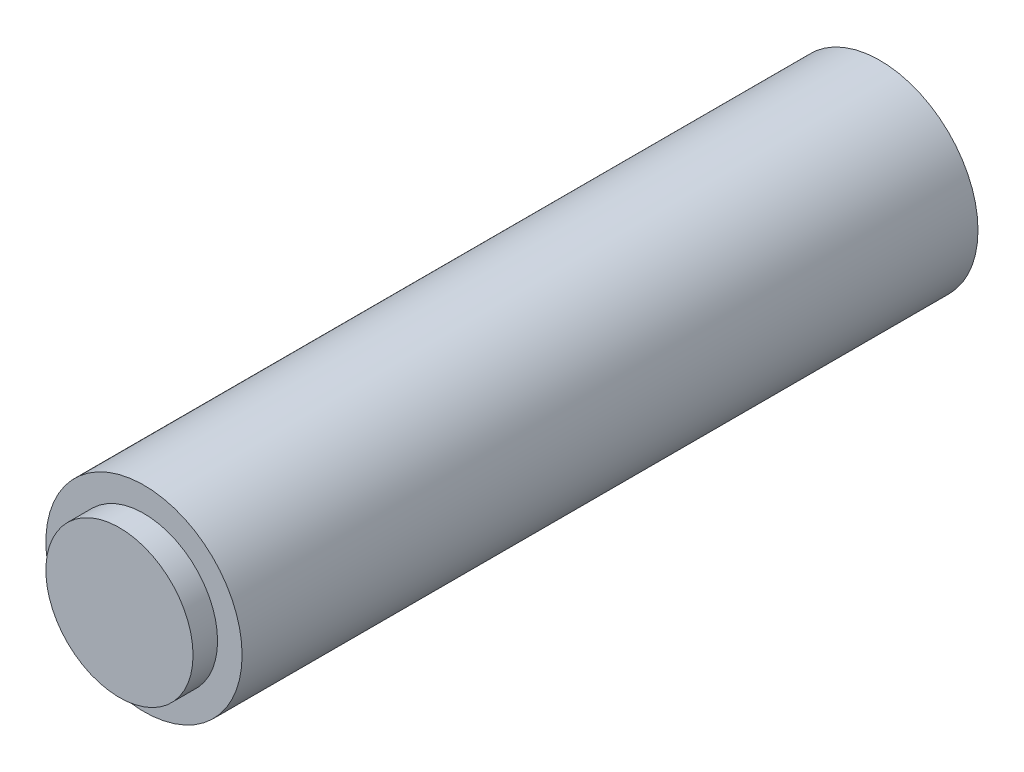
ISO-10303-21;
HEADER;
FILE_DESCRIPTION(('STEP AP214'),'2;1');
FILE_NAME('part.step','',(''),(''),'','','');
FILE_SCHEMA(('AUTOMOTIVE_DESIGN { 1 0 10303 214 1 1 1 1 }'));
ENDSEC;
DATA;
#1=APPLICATION_CONTEXT('core data for automotive mechanical design processes');
#2=APPLICATION_PROTOCOL_DEFINITION('international standard','automotive_design',2000,#1);
#3=PRODUCT_CONTEXT('',#1,'mechanical');
#4=PRODUCT('Part','Part','',(#3));
#5=PRODUCT_RELATED_PRODUCT_CATEGORY('part','',(#4));
#6=PRODUCT_DEFINITION_FORMATION('','',#4);
#7=PRODUCT_DEFINITION_CONTEXT('part definition',#1,'design');
#8=PRODUCT_DEFINITION('design','',#6,#7);
#9=PRODUCT_DEFINITION_SHAPE('','',#8);
#10=(LENGTH_UNIT() NAMED_UNIT(*) SI_UNIT(.MILLI.,.METRE.));
#11=(NAMED_UNIT(*) PLANE_ANGLE_UNIT() SI_UNIT($,.RADIAN.));
#12=(NAMED_UNIT(*) SI_UNIT($,.STERADIAN.) SOLID_ANGLE_UNIT());
#13=UNCERTAINTY_MEASURE_WITH_UNIT(LENGTH_MEASURE(1.E-05),#10,'distance_accuracy_value','');
#14=(GEOMETRIC_REPRESENTATION_CONTEXT(3) GLOBAL_UNCERTAINTY_ASSIGNED_CONTEXT((#13)) GLOBAL_UNIT_ASSIGNED_CONTEXT((#10,
#11,#12)) REPRESENTATION_CONTEXT('',''));
#15=CARTESIAN_POINT('',(0.,0.,0.));
#16=DIRECTION('',(0.,0.,1.));
#17=DIRECTION('',(1.,0.,0.));
#18=AXIS2_PLACEMENT_3D('',#15,#16,#17);
#19=CARTESIAN_POINT('',(0.,0.,77.5));
#20=DIRECTION('',(0.,0.,-1.));
#21=DIRECTION('',(-1.,0.,0.));
#22=AXIS2_PLACEMENT_3D('',#19,#20,#21);
#23=CYLINDRICAL_SURFACE('',#22,10.);
#24=CARTESIAN_POINT('',(0.,0.,0.));
#25=DIRECTION('',(0.,0.,1.));
#26=DIRECTION('',(1.,0.,0.));
#27=AXIS2_PLACEMENT_3D('',#24,#25,#26);
#28=CIRCLE('',#27,10.);
#29=CARTESIAN_POINT('',(10.,0.,0.));
#30=VERTEX_POINT('',#29);
#31=EDGE_CURVE('E11',#30,#30,#28,.T.);
#32=ORIENTED_EDGE('',*,*,#31,.T.);
#33=EDGE_LOOP('',(#32));
#34=FACE_BOUND('',#33,.T.);
#35=CARTESIAN_POINT('',(0.,0.,75.));
#36=DIRECTION('',(0.,0.,1.));
#37=DIRECTION('',(1.,0.,0.));
#38=AXIS2_PLACEMENT_3D('',#35,#36,#37);
#39=CIRCLE('',#38,10.);
#40=CARTESIAN_POINT('',(10.,0.,75.));
#41=VERTEX_POINT('',#40);
#42=EDGE_CURVE('E41',#41,#41,#39,.T.);
#43=ORIENTED_EDGE('',*,*,#42,.F.);
#44=EDGE_LOOP('',(#43));
#45=FACE_BOUND('',#44,.T.);
#46=ADVANCED_FACE('F38',(#34,#45),#23,.T.);
#47=CARTESIAN_POINT('',(0.,0.,0.));
#48=DIRECTION('',(0.,0.,1.));
#49=DIRECTION('',(1.,0.,0.));
#50=AXIS2_PLACEMENT_3D('',#47,#48,#49);
#51=PLANE('',#50);
#52=ORIENTED_EDGE('',*,*,#31,.F.);
#53=EDGE_LOOP('',(#52));
#54=FACE_BOUND('',#53,.T.);
#55=ADVANCED_FACE('F66',(#54),#51,.F.);
#56=CARTESIAN_POINT('',(0.,0.,75.));
#57=DIRECTION('',(0.,0.,1.));
#58=DIRECTION('',(1.,0.,0.));
#59=AXIS2_PLACEMENT_3D('',#56,#57,#58);
#60=PLANE('',#59);
#61=CARTESIAN_POINT('',(0.,0.,75.));
#62=DIRECTION('',(0.,0.,1.));
#63=DIRECTION('',(1.,0.,0.));
#64=AXIS2_PLACEMENT_3D('',#61,#62,#63);
#65=CIRCLE('',#64,7.5);
#66=CARTESIAN_POINT('',(7.5,0.,75.));
#67=VERTEX_POINT('',#66);
#68=EDGE_CURVE('E50',#67,#67,#65,.T.);
#69=ORIENTED_EDGE('',*,*,#68,.F.);
#70=EDGE_LOOP('',(#69));
#71=FACE_BOUND('',#70,.T.);
#72=ORIENTED_EDGE('',*,*,#42,.T.);
#73=EDGE_LOOP('',(#72));
#74=FACE_BOUND('',#73,.T.);
#75=ADVANCED_FACE('F63',(#71,#74),#60,.T.);
#76=CARTESIAN_POINT('',(0.,0.,75.));
#77=DIRECTION('',(0.,0.,1.));
#78=DIRECTION('',(1.,0.,0.));
#79=AXIS2_PLACEMENT_3D('',#76,#77,#78);
#80=CYLINDRICAL_SURFACE('',#79,7.5);
#81=ORIENTED_EDGE('',*,*,#68,.T.);
#82=EDGE_LOOP('',(#81));
#83=FACE_BOUND('',#82,.T.);
#84=CARTESIAN_POINT('',(0.,0.,77.5));
#85=DIRECTION('',(0.,0.,1.));
#86=DIRECTION('',(1.,0.,0.));
#87=AXIS2_PLACEMENT_3D('',#84,#85,#86);
#88=CIRCLE('',#87,7.5);
#89=CARTESIAN_POINT('',(7.5,0.,77.5));
#90=VERTEX_POINT('',#89);
#91=EDGE_CURVE('E52',#90,#90,#88,.T.);
#92=ORIENTED_EDGE('',*,*,#91,.F.);
#93=EDGE_LOOP('',(#92));
#94=FACE_BOUND('',#93,.T.);
#95=ADVANCED_FACE('F60',(#83,#94),#80,.T.);
#96=CARTESIAN_POINT('',(0.,0.,77.5));
#97=DIRECTION('',(0.,0.,1.));
#98=DIRECTION('',(1.,0.,0.));
#99=AXIS2_PLACEMENT_3D('',#96,#97,#98);
#100=PLANE('',#99);
#101=ORIENTED_EDGE('',*,*,#91,.T.);
#102=EDGE_LOOP('',(#101));
#103=FACE_BOUND('',#102,.T.);
#104=ADVANCED_FACE('F78',(#103),#100,.T.);
#105=CLOSED_SHELL('',(#46,#55,#75,#95,#104));
#106=MANIFOLD_SOLID_BREP('B2',#105);
#107=ADVANCED_BREP_SHAPE_REPRESENTATION('',(#18,#106),#14);
#108=SHAPE_DEFINITION_REPRESENTATION(#9,#107);
ENDSEC;
END-ISO-10303-21;
